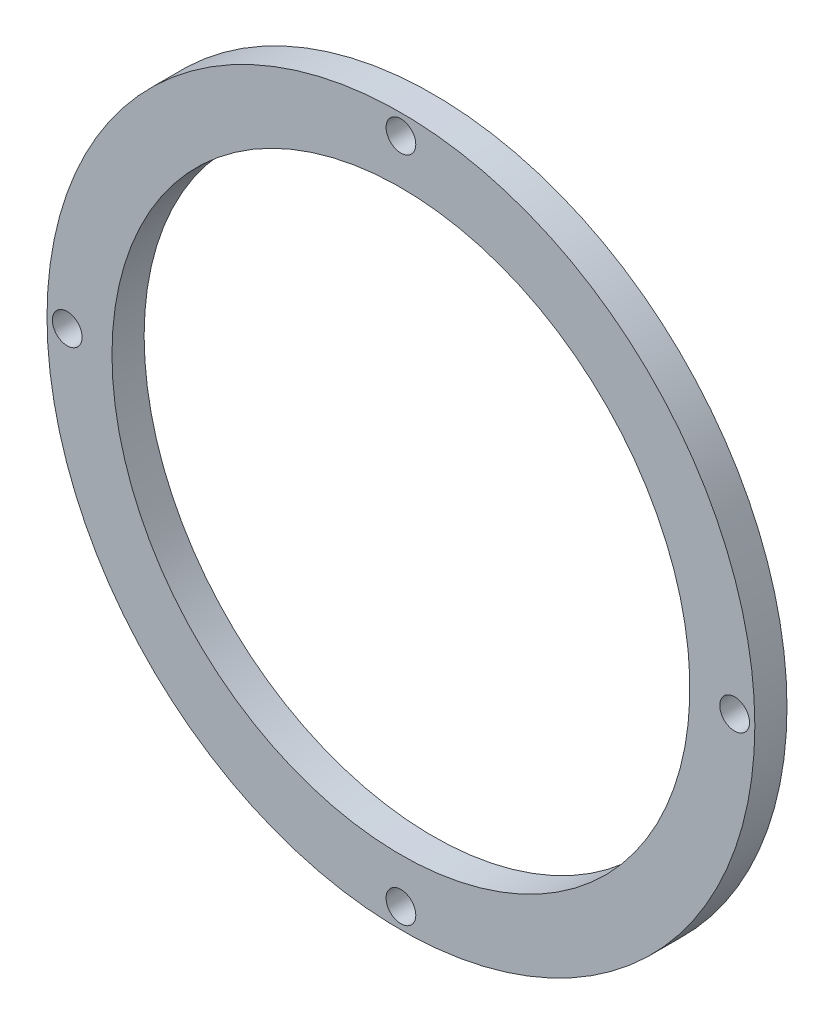
ISO-10303-21;
HEADER;
FILE_DESCRIPTION(('STEP AP214'),'2;1');
FILE_NAME('part.step','',(''),(''),'','','');
FILE_SCHEMA(('AUTOMOTIVE_DESIGN { 1 0 10303 214 1 1 1 1 }'));
ENDSEC;
DATA;
#1=APPLICATION_CONTEXT('core data for automotive mechanical design processes');
#2=APPLICATION_PROTOCOL_DEFINITION('international standard','automotive_design',2000,#1);
#3=PRODUCT_CONTEXT('',#1,'mechanical');
#4=PRODUCT('Part','Part','',(#3));
#5=PRODUCT_RELATED_PRODUCT_CATEGORY('part','',(#4));
#6=PRODUCT_DEFINITION_FORMATION('','',#4);
#7=PRODUCT_DEFINITION_CONTEXT('part definition',#1,'design');
#8=PRODUCT_DEFINITION('design','',#6,#7);
#9=PRODUCT_DEFINITION_SHAPE('','',#8);
#10=(LENGTH_UNIT() NAMED_UNIT(*) SI_UNIT(.MILLI.,.METRE.));
#11=(NAMED_UNIT(*) PLANE_ANGLE_UNIT() SI_UNIT($,.RADIAN.));
#12=(NAMED_UNIT(*) SI_UNIT($,.STERADIAN.) SOLID_ANGLE_UNIT());
#13=UNCERTAINTY_MEASURE_WITH_UNIT(LENGTH_MEASURE(1.E-05),#10,'distance_accuracy_value','');
#14=(GEOMETRIC_REPRESENTATION_CONTEXT(3) GLOBAL_UNCERTAINTY_ASSIGNED_CONTEXT((#13)) GLOBAL_UNIT_ASSIGNED_CONTEXT((#10,
#11,#12)) REPRESENTATION_CONTEXT('',''));
#15=CARTESIAN_POINT('',(0.,0.,0.));
#16=DIRECTION('',(0.,0.,1.));
#17=DIRECTION('',(1.,0.,0.));
#18=AXIS2_PLACEMENT_3D('',#15,#16,#17);
#19=CARTESIAN_POINT('',(0.,0.,3.18));
#20=DIRECTION('',(0.,0.,1.));
#21=DIRECTION('',(1.,0.,0.));
#22=AXIS2_PLACEMENT_3D('',#19,#20,#21);
#23=PLANE('',#22);
#24=CARTESIAN_POINT('',(-33.,-1.15218884181823E-13,3.18));
#25=DIRECTION('',(0.,0.,1.));
#26=DIRECTION('',(0.,1.,0.));
#27=AXIS2_PLACEMENT_3D('',#24,#25,#26);
#28=CIRCLE('',#27,1.47);
#29=CARTESIAN_POINT('',(-31.53,-1.15218884181823E-13,3.18));
#30=VERTEX_POINT('',#29);
#31=EDGE_CURVE('E84',#30,#30,#28,.T.);
#32=ORIENTED_EDGE('',*,*,#31,.F.);
#33=EDGE_LOOP('',(#32));
#34=FACE_BOUND('',#33,.T.);
#35=CARTESIAN_POINT('',(0.,-33.,3.18));
#36=DIRECTION('',(0.,0.,1.));
#37=DIRECTION('',(-1.,0.,0.));
#38=AXIS2_PLACEMENT_3D('',#35,#36,#37);
#39=CIRCLE('',#38,1.47);
#40=CARTESIAN_POINT('',(1.47,-33.,3.18));
#41=VERTEX_POINT('',#40);
#42=EDGE_CURVE('E76',#41,#41,#39,.T.);
#43=ORIENTED_EDGE('',*,*,#42,.F.);
#44=EDGE_LOOP('',(#43));
#45=FACE_BOUND('',#44,.T.);
#46=CARTESIAN_POINT('',(33.,3.4565665254547E-13,3.18));
#47=DIRECTION('',(0.,0.,1.));
#48=DIRECTION('',(0.,-1.,0.));
#49=AXIS2_PLACEMENT_3D('',#46,#47,#48);
#50=CIRCLE('',#49,1.47);
#51=CARTESIAN_POINT('',(34.47,3.4565665254547E-13,3.18));
#52=VERTEX_POINT('',#51);
#53=EDGE_CURVE('E68',#52,#52,#50,.T.);
#54=ORIENTED_EDGE('',*,*,#53,.F.);
#55=EDGE_LOOP('',(#54));
#56=FACE_BOUND('',#55,.T.);
#57=CARTESIAN_POINT('',(0.,33.,3.18));
#58=DIRECTION('',(0.,0.,1.));
#59=DIRECTION('',(1.,0.,0.));
#60=AXIS2_PLACEMENT_3D('',#57,#58,#59);
#61=CIRCLE('',#60,1.47);
#62=CARTESIAN_POINT('',(1.47,33.,3.18));
#63=VERTEX_POINT('',#62);
#64=EDGE_CURVE('E60',#63,#63,#61,.T.);
#65=ORIENTED_EDGE('',*,*,#64,.F.);
#66=EDGE_LOOP('',(#65));
#67=FACE_BOUND('',#66,.T.);
#68=CARTESIAN_POINT('',(0.,0.,3.18));
#69=DIRECTION('',(0.,0.,1.));
#70=DIRECTION('',(1.,0.,0.));
#71=AXIS2_PLACEMENT_3D('',#68,#69,#70);
#72=CIRCLE('',#71,35.);
#73=CARTESIAN_POINT('',(-35.,0.,3.18));
#74=VERTEX_POINT('',#73);
#75=EDGE_CURVE('E10',#74,#74,#72,.T.);
#76=ORIENTED_EDGE('',*,*,#75,.T.);
#77=EDGE_LOOP('',(#76));
#78=FACE_BOUND('',#77,.T.);
#79=CARTESIAN_POINT('',(0.,0.,3.18));
#80=DIRECTION('',(0.,0.,1.));
#81=DIRECTION('',(1.,0.,0.));
#82=AXIS2_PLACEMENT_3D('',#79,#80,#81);
#83=CIRCLE('',#82,28.575);
#84=CARTESIAN_POINT('',(-28.575,0.,3.18));
#85=VERTEX_POINT('',#84);
#86=EDGE_CURVE('E50',#85,#85,#83,.T.);
#87=ORIENTED_EDGE('',*,*,#86,.F.);
#88=EDGE_LOOP('',(#87));
#89=FACE_BOUND('',#88,.T.);
#90=ADVANCED_FACE('F37',(#34,#45,#56,#67,#78,#89),#23,.T.);
#91=CARTESIAN_POINT('',(0.,0.,0.));
#92=DIRECTION('',(0.,0.,1.));
#93=DIRECTION('',(1.,0.,0.));
#94=AXIS2_PLACEMENT_3D('',#91,#92,#93);
#95=PLANE('',#94);
#96=CARTESIAN_POINT('',(-33.,-1.15218884181823E-13,0.));
#97=DIRECTION('',(0.,0.,1.));
#98=DIRECTION('',(0.,1.,0.));
#99=AXIS2_PLACEMENT_3D('',#96,#97,#98);
#100=CIRCLE('',#99,1.47);
#101=CARTESIAN_POINT('',(-31.53,-1.15218884181823E-13,0.));
#102=VERTEX_POINT('',#101);
#103=EDGE_CURVE('E64',#102,#102,#100,.T.);
#104=ORIENTED_EDGE('',*,*,#103,.T.);
#105=EDGE_LOOP('',(#104));
#106=FACE_BOUND('',#105,.T.);
#107=CARTESIAN_POINT('',(0.,-33.,0.));
#108=DIRECTION('',(0.,0.,1.));
#109=DIRECTION('',(-1.,0.,0.));
#110=AXIS2_PLACEMENT_3D('',#107,#108,#109);
#111=CIRCLE('',#110,1.47);
#112=CARTESIAN_POINT('',(1.47,-33.,0.));
#113=VERTEX_POINT('',#112);
#114=EDGE_CURVE('E80',#113,#113,#111,.T.);
#115=ORIENTED_EDGE('',*,*,#114,.T.);
#116=EDGE_LOOP('',(#115));
#117=FACE_BOUND('',#116,.T.);
#118=CARTESIAN_POINT('',(33.,3.4565665254547E-13,0.));
#119=DIRECTION('',(0.,0.,1.));
#120=DIRECTION('',(0.,-1.,0.));
#121=AXIS2_PLACEMENT_3D('',#118,#119,#120);
#122=CIRCLE('',#121,1.47);
#123=CARTESIAN_POINT('',(34.47,3.4565665254547E-13,0.));
#124=VERTEX_POINT('',#123);
#125=EDGE_CURVE('E72',#124,#124,#122,.T.);
#126=ORIENTED_EDGE('',*,*,#125,.T.);
#127=EDGE_LOOP('',(#126));
#128=FACE_BOUND('',#127,.T.);
#129=CARTESIAN_POINT('',(0.,33.,0.));
#130=DIRECTION('',(0.,0.,1.));
#131=DIRECTION('',(1.,0.,0.));
#132=AXIS2_PLACEMENT_3D('',#129,#130,#131);
#133=CIRCLE('',#132,1.47);
#134=CARTESIAN_POINT('',(1.47,33.,0.));
#135=VERTEX_POINT('',#134);
#136=EDGE_CURVE('E56',#135,#135,#133,.T.);
#137=ORIENTED_EDGE('',*,*,#136,.T.);
#138=EDGE_LOOP('',(#137));
#139=FACE_BOUND('',#138,.T.);
#140=CARTESIAN_POINT('',(0.,0.,0.));
#141=DIRECTION('',(0.,0.,1.));
#142=DIRECTION('',(1.,0.,0.));
#143=AXIS2_PLACEMENT_3D('',#140,#141,#142);
#144=CIRCLE('',#143,35.);
#145=CARTESIAN_POINT('',(-35.,0.,0.));
#146=VERTEX_POINT('',#145);
#147=EDGE_CURVE('E41',#146,#146,#144,.T.);
#148=ORIENTED_EDGE('',*,*,#147,.F.);
#149=EDGE_LOOP('',(#148));
#150=FACE_BOUND('',#149,.T.);
#151=CARTESIAN_POINT('',(0.,0.,0.));
#152=DIRECTION('',(0.,0.,1.));
#153=DIRECTION('',(1.,0.,0.));
#154=AXIS2_PLACEMENT_3D('',#151,#152,#153);
#155=CIRCLE('',#154,28.575);
#156=CARTESIAN_POINT('',(-28.575,0.,0.));
#157=VERTEX_POINT('',#156);
#158=EDGE_CURVE('E52',#157,#157,#155,.T.);
#159=ORIENTED_EDGE('',*,*,#158,.T.);
#160=EDGE_LOOP('',(#159));
#161=FACE_BOUND('',#160,.T.);
#162=ADVANCED_FACE('F92',(#106,#117,#128,#139,#150,#161),#95,.F.);
#163=CARTESIAN_POINT('',(0.,0.,3.18));
#164=DIRECTION('',(0.,0.,-1.));
#165=DIRECTION('',(-1.,0.,0.));
#166=AXIS2_PLACEMENT_3D('',#163,#164,#165);
#167=CYLINDRICAL_SURFACE('',#166,35.);
#168=CARTESIAN_POINT('',(-35.,0.,3.18));
#169=CARTESIAN_POINT('',(-35.,0.,3.146875));
#170=CARTESIAN_POINT('',(-35.,0.,3.11375));
#171=CARTESIAN_POINT('',(-35.,0.,3.0475));
#172=CARTESIAN_POINT('',(-35.,0.,3.014375));
#173=CARTESIAN_POINT('',(-35.,0.,2.948125));
#174=CARTESIAN_POINT('',(-35.,0.,2.915));
#175=CARTESIAN_POINT('',(-35.,0.,2.84875));
#176=CARTESIAN_POINT('',(-35.,0.,2.815625));
#177=CARTESIAN_POINT('',(-35.,0.,2.749375));
#178=CARTESIAN_POINT('',(-35.,0.,2.71625));
#179=CARTESIAN_POINT('',(-35.,0.,2.65));
#180=CARTESIAN_POINT('',(-35.,0.,2.616875));
#181=CARTESIAN_POINT('',(-35.,0.,2.550625));
#182=CARTESIAN_POINT('',(-35.,0.,2.5175));
#183=CARTESIAN_POINT('',(-35.,0.,2.45125));
#184=CARTESIAN_POINT('',(-35.,0.,2.418125));
#185=CARTESIAN_POINT('',(-35.,0.,2.351875));
#186=CARTESIAN_POINT('',(-35.,0.,2.31875));
#187=CARTESIAN_POINT('',(-35.,0.,2.2525));
#188=CARTESIAN_POINT('',(-35.,0.,2.219375));
#189=CARTESIAN_POINT('',(-35.,0.,2.153125));
#190=CARTESIAN_POINT('',(-35.,0.,2.12));
#191=CARTESIAN_POINT('',(-35.,0.,2.05375));
#192=CARTESIAN_POINT('',(-35.,0.,2.020625));
#193=CARTESIAN_POINT('',(-35.,0.,1.954375));
#194=CARTESIAN_POINT('',(-35.,0.,1.92125));
#195=CARTESIAN_POINT('',(-35.,0.,1.855));
#196=CARTESIAN_POINT('',(-35.,0.,1.821875));
#197=CARTESIAN_POINT('',(-35.,0.,1.755625));
#198=CARTESIAN_POINT('',(-35.,0.,1.7225));
#199=CARTESIAN_POINT('',(-35.,0.,1.65625));
#200=CARTESIAN_POINT('',(-35.,0.,1.623125));
#201=CARTESIAN_POINT('',(-35.,0.,1.556875));
#202=CARTESIAN_POINT('',(-35.,0.,1.52375));
#203=CARTESIAN_POINT('',(-35.,0.,1.4575));
#204=CARTESIAN_POINT('',(-35.,0.,1.424375));
#205=CARTESIAN_POINT('',(-35.,0.,1.358125));
#206=CARTESIAN_POINT('',(-35.,0.,1.325));
#207=CARTESIAN_POINT('',(-35.,0.,1.25875));
#208=CARTESIAN_POINT('',(-35.,0.,1.225625));
#209=CARTESIAN_POINT('',(-35.,0.,1.159375));
#210=CARTESIAN_POINT('',(-35.,0.,1.12625));
#211=CARTESIAN_POINT('',(-35.,0.,1.06));
#212=CARTESIAN_POINT('',(-35.,0.,1.026875));
#213=CARTESIAN_POINT('',(-35.,0.,0.960625));
#214=CARTESIAN_POINT('',(-35.,0.,0.9275));
#215=CARTESIAN_POINT('',(-35.,0.,0.86125));
#216=CARTESIAN_POINT('',(-35.,0.,0.828125));
#217=CARTESIAN_POINT('',(-35.,0.,0.761875));
#218=CARTESIAN_POINT('',(-35.,0.,0.72875));
#219=CARTESIAN_POINT('',(-35.,0.,0.6625));
#220=CARTESIAN_POINT('',(-35.,0.,0.629375));
#221=CARTESIAN_POINT('',(-35.,0.,0.563125));
#222=CARTESIAN_POINT('',(-35.,0.,0.53));
#223=CARTESIAN_POINT('',(-35.,0.,0.46375));
#224=CARTESIAN_POINT('',(-35.,0.,0.430625));
#225=CARTESIAN_POINT('',(-35.,0.,0.364375));
#226=CARTESIAN_POINT('',(-35.,0.,0.33125));
#227=CARTESIAN_POINT('',(-35.,0.,0.265));
#228=CARTESIAN_POINT('',(-35.,0.,0.231875));
#229=CARTESIAN_POINT('',(-35.,0.,0.165625));
#230=CARTESIAN_POINT('',(-35.,0.,0.1325));
#231=CARTESIAN_POINT('',(-35.,0.,0.06625));
#232=CARTESIAN_POINT('',(-35.,0.,0.033125));
#233=CARTESIAN_POINT('',(-35.,0.,0.));
#234=B_SPLINE_CURVE_WITH_KNOTS('',3,(#168,#169,#170,#171,#172,#173,#174,#175,#176,#177,#178,
#179,#180,#181,#182,#183,#184,#185,#186,#187,#188,#189,#190,#191,#192,#193,#194,#195,#196,#197,
#198,#199,#200,#201,#202,#203,#204,#205,#206,#207,#208,#209,#210,#211,#212,#213,#214,#215,#216,
#217,#218,#219,#220,#221,#222,#223,#224,#225,#226,#227,#228,#229,#230,#231,#232,#233),
.UNSPECIFIED.,.F.,.F.,(4,2,2,2,2,2,2,2,2,2,2,2,2,2,2,2,2,2,2,2,2,2,2,2,2,2,2,2,2,2,2,2,4),(0.,
0.0993749999999996,0.19875,0.298125,0.3975,0.496875,0.59625,0.695625,0.795,0.894375,0.99375,
1.093125,1.1925,1.291875,1.39125,1.490625,1.59,1.689375,1.78875,1.888125,1.9875,2.086875,
2.18625,2.285625,2.385,2.484375,2.58375,2.683125,2.7825,2.881875,2.98125,3.080625,3.18),.UNSPECIFIED.);
#235=EDGE_CURVE('BSEAM39',#74,#146,#234,.T.);
#236=ORIENTED_EDGE('',*,*,#75,.F.);
#237=ORIENTED_EDGE('',*,*,#147,.T.);
#238=ORIENTED_EDGE('',*,*,#235,.T.);
#239=ORIENTED_EDGE('',*,*,#235,.F.);
#240=EDGE_LOOP('',(#236,#238,#237,#239));
#241=FACE_BOUND('',#240,.T.);
#242=ADVANCED_FACE('F39',(#241),#167,.T.);
#243=CARTESIAN_POINT('',(0.,0.,3.18));
#244=DIRECTION('',(0.,0.,-1.));
#245=DIRECTION('',(-1.,0.,0.));
#246=AXIS2_PLACEMENT_3D('',#243,#244,#245);
#247=CYLINDRICAL_SURFACE('',#246,28.575);
#248=CARTESIAN_POINT('',(-28.575,0.,3.18));
#249=CARTESIAN_POINT('',(-28.575,0.,3.146875));
#250=CARTESIAN_POINT('',(-28.575,0.,3.11375));
#251=CARTESIAN_POINT('',(-28.575,0.,3.0475));
#252=CARTESIAN_POINT('',(-28.575,0.,3.014375));
#253=CARTESIAN_POINT('',(-28.575,0.,2.948125));
#254=CARTESIAN_POINT('',(-28.575,0.,2.915));
#255=CARTESIAN_POINT('',(-28.575,0.,2.84875));
#256=CARTESIAN_POINT('',(-28.575,0.,2.815625));
#257=CARTESIAN_POINT('',(-28.575,0.,2.749375));
#258=CARTESIAN_POINT('',(-28.575,0.,2.71625));
#259=CARTESIAN_POINT('',(-28.575,0.,2.65));
#260=CARTESIAN_POINT('',(-28.575,0.,2.616875));
#261=CARTESIAN_POINT('',(-28.575,0.,2.550625));
#262=CARTESIAN_POINT('',(-28.575,0.,2.5175));
#263=CARTESIAN_POINT('',(-28.575,0.,2.45125));
#264=CARTESIAN_POINT('',(-28.575,0.,2.418125));
#265=CARTESIAN_POINT('',(-28.575,0.,2.351875));
#266=CARTESIAN_POINT('',(-28.575,0.,2.31875));
#267=CARTESIAN_POINT('',(-28.575,0.,2.2525));
#268=CARTESIAN_POINT('',(-28.575,0.,2.219375));
#269=CARTESIAN_POINT('',(-28.575,0.,2.153125));
#270=CARTESIAN_POINT('',(-28.575,0.,2.12));
#271=CARTESIAN_POINT('',(-28.575,0.,2.05375));
#272=CARTESIAN_POINT('',(-28.575,0.,2.020625));
#273=CARTESIAN_POINT('',(-28.575,0.,1.954375));
#274=CARTESIAN_POINT('',(-28.575,0.,1.92125));
#275=CARTESIAN_POINT('',(-28.575,0.,1.855));
#276=CARTESIAN_POINT('',(-28.575,0.,1.821875));
#277=CARTESIAN_POINT('',(-28.575,0.,1.755625));
#278=CARTESIAN_POINT('',(-28.575,0.,1.7225));
#279=CARTESIAN_POINT('',(-28.575,0.,1.65625));
#280=CARTESIAN_POINT('',(-28.575,0.,1.623125));
#281=CARTESIAN_POINT('',(-28.575,0.,1.556875));
#282=CARTESIAN_POINT('',(-28.575,0.,1.52375));
#283=CARTESIAN_POINT('',(-28.575,0.,1.4575));
#284=CARTESIAN_POINT('',(-28.575,0.,1.424375));
#285=CARTESIAN_POINT('',(-28.575,0.,1.358125));
#286=CARTESIAN_POINT('',(-28.575,0.,1.325));
#287=CARTESIAN_POINT('',(-28.575,0.,1.25875));
#288=CARTESIAN_POINT('',(-28.575,0.,1.225625));
#289=CARTESIAN_POINT('',(-28.575,0.,1.159375));
#290=CARTESIAN_POINT('',(-28.575,0.,1.12625));
#291=CARTESIAN_POINT('',(-28.575,0.,1.06));
#292=CARTESIAN_POINT('',(-28.575,0.,1.026875));
#293=CARTESIAN_POINT('',(-28.575,0.,0.960625));
#294=CARTESIAN_POINT('',(-28.575,0.,0.9275));
#295=CARTESIAN_POINT('',(-28.575,0.,0.86125));
#296=CARTESIAN_POINT('',(-28.575,0.,0.828125));
#297=CARTESIAN_POINT('',(-28.575,0.,0.761875));
#298=CARTESIAN_POINT('',(-28.575,0.,0.72875));
#299=CARTESIAN_POINT('',(-28.575,0.,0.6625));
#300=CARTESIAN_POINT('',(-28.575,0.,0.629375));
#301=CARTESIAN_POINT('',(-28.575,0.,0.563125));
#302=CARTESIAN_POINT('',(-28.575,0.,0.53));
#303=CARTESIAN_POINT('',(-28.575,0.,0.46375));
#304=CARTESIAN_POINT('',(-28.575,0.,0.430625));
#305=CARTESIAN_POINT('',(-28.575,0.,0.364375));
#306=CARTESIAN_POINT('',(-28.575,0.,0.33125));
#307=CARTESIAN_POINT('',(-28.575,0.,0.265));
#308=CARTESIAN_POINT('',(-28.575,0.,0.231875));
#309=CARTESIAN_POINT('',(-28.575,0.,0.165625));
#310=CARTESIAN_POINT('',(-28.575,0.,0.1325));
#311=CARTESIAN_POINT('',(-28.575,0.,0.06625));
#312=CARTESIAN_POINT('',(-28.575,0.,0.033125));
#313=CARTESIAN_POINT('',(-28.575,0.,0.));
#314=B_SPLINE_CURVE_WITH_KNOTS('',3,(#248,#249,#250,#251,#252,#253,#254,#255,#256,#257,#258,
#259,#260,#261,#262,#263,#264,#265,#266,#267,#268,#269,#270,#271,#272,#273,#274,#275,#276,#277,
#278,#279,#280,#281,#282,#283,#284,#285,#286,#287,#288,#289,#290,#291,#292,#293,#294,#295,#296,
#297,#298,#299,#300,#301,#302,#303,#304,#305,#306,#307,#308,#309,#310,#311,#312,#313),
.UNSPECIFIED.,.F.,.F.,(4,2,2,2,2,2,2,2,2,2,2,2,2,2,2,2,2,2,2,2,2,2,2,2,2,2,2,2,2,2,2,2,4),(0.,
0.0993749999999996,0.19875,0.298125,0.3975,0.496875,0.59625,0.695625,0.795,0.894375,0.99375,
1.093125,1.1925,1.291875,1.39125,1.490625,1.59,1.689375,1.78875,1.888125,1.9875,2.086875,
2.18625,2.285625,2.385,2.484375,2.58375,2.683125,2.7825,2.881875,2.98125,3.080625,3.18),.UNSPECIFIED.);
#315=EDGE_CURVE('BSEAM113',#85,#157,#314,.T.);
#316=ORIENTED_EDGE('',*,*,#86,.T.);
#317=ORIENTED_EDGE('',*,*,#158,.F.);
#318=ORIENTED_EDGE('',*,*,#315,.T.);
#319=ORIENTED_EDGE('',*,*,#315,.F.);
#320=EDGE_LOOP('',(#316,#318,#317,#319));
#321=FACE_BOUND('',#320,.T.);
#322=ADVANCED_FACE('F113',(#321),#247,.F.);
#323=CARTESIAN_POINT('',(0.,33.,0.));
#324=DIRECTION('',(0.,0.,1.));
#325=DIRECTION('',(1.,0.,0.));
#326=AXIS2_PLACEMENT_3D('',#323,#324,#325);
#327=CYLINDRICAL_SURFACE('',#326,1.47);
#328=CARTESIAN_POINT('',(1.47,33.,0.));
#329=CARTESIAN_POINT('',(1.47,33.,0.033125));
#330=CARTESIAN_POINT('',(1.47,33.,0.06625));
#331=CARTESIAN_POINT('',(1.47,33.,0.1325));
#332=CARTESIAN_POINT('',(1.47,33.,0.165625));
#333=CARTESIAN_POINT('',(1.47,33.,0.231875));
#334=CARTESIAN_POINT('',(1.47,33.,0.265));
#335=CARTESIAN_POINT('',(1.47,33.,0.33125));
#336=CARTESIAN_POINT('',(1.47,33.,0.364375));
#337=CARTESIAN_POINT('',(1.47,33.,0.430625));
#338=CARTESIAN_POINT('',(1.47,33.,0.46375));
#339=CARTESIAN_POINT('',(1.47,33.,0.53));
#340=CARTESIAN_POINT('',(1.47,33.,0.563125));
#341=CARTESIAN_POINT('',(1.47,33.,0.629375));
#342=CARTESIAN_POINT('',(1.47,33.,0.6625));
#343=CARTESIAN_POINT('',(1.47,33.,0.72875));
#344=CARTESIAN_POINT('',(1.47,33.,0.761875));
#345=CARTESIAN_POINT('',(1.47,33.,0.828125));
#346=CARTESIAN_POINT('',(1.47,33.,0.86125));
#347=CARTESIAN_POINT('',(1.47,33.,0.9275));
#348=CARTESIAN_POINT('',(1.47,33.,0.960625));
#349=CARTESIAN_POINT('',(1.47,33.,1.026875));
#350=CARTESIAN_POINT('',(1.47,33.,1.06));
#351=CARTESIAN_POINT('',(1.47,33.,1.12625));
#352=CARTESIAN_POINT('',(1.47,33.,1.159375));
#353=CARTESIAN_POINT('',(1.47,33.,1.225625));
#354=CARTESIAN_POINT('',(1.47,33.,1.25875));
#355=CARTESIAN_POINT('',(1.47,33.,1.325));
#356=CARTESIAN_POINT('',(1.47,33.,1.358125));
#357=CARTESIAN_POINT('',(1.47,33.,1.424375));
#358=CARTESIAN_POINT('',(1.47,33.,1.4575));
#359=CARTESIAN_POINT('',(1.47,33.,1.52375));
#360=CARTESIAN_POINT('',(1.47,33.,1.556875));
#361=CARTESIAN_POINT('',(1.47,33.,1.623125));
#362=CARTESIAN_POINT('',(1.47,33.,1.65625));
#363=CARTESIAN_POINT('',(1.47,33.,1.7225));
#364=CARTESIAN_POINT('',(1.47,33.,1.755625));
#365=CARTESIAN_POINT('',(1.47,33.,1.821875));
#366=CARTESIAN_POINT('',(1.47,33.,1.855));
#367=CARTESIAN_POINT('',(1.47,33.,1.92125));
#368=CARTESIAN_POINT('',(1.47,33.,1.954375));
#369=CARTESIAN_POINT('',(1.47,33.,2.020625));
#370=CARTESIAN_POINT('',(1.47,33.,2.05375));
#371=CARTESIAN_POINT('',(1.47,33.,2.12));
#372=CARTESIAN_POINT('',(1.47,33.,2.153125));
#373=CARTESIAN_POINT('',(1.47,33.,2.219375));
#374=CARTESIAN_POINT('',(1.47,33.,2.2525));
#375=CARTESIAN_POINT('',(1.47,33.,2.31875));
#376=CARTESIAN_POINT('',(1.47,33.,2.351875));
#377=CARTESIAN_POINT('',(1.47,33.,2.418125));
#378=CARTESIAN_POINT('',(1.47,33.,2.45125));
#379=CARTESIAN_POINT('',(1.47,33.,2.5175));
#380=CARTESIAN_POINT('',(1.47,33.,2.550625));
#381=CARTESIAN_POINT('',(1.47,33.,2.616875));
#382=CARTESIAN_POINT('',(1.47,33.,2.65));
#383=CARTESIAN_POINT('',(1.47,33.,2.71625));
#384=CARTESIAN_POINT('',(1.47,33.,2.749375));
#385=CARTESIAN_POINT('',(1.47,33.,2.815625));
#386=CARTESIAN_POINT('',(1.47,33.,2.84875));
#387=CARTESIAN_POINT('',(1.47,33.,2.915));
#388=CARTESIAN_POINT('',(1.47,33.,2.948125));
#389=CARTESIAN_POINT('',(1.47,33.,3.014375));
#390=CARTESIAN_POINT('',(1.47,33.,3.0475));
#391=CARTESIAN_POINT('',(1.47,33.,3.11375));
#392=CARTESIAN_POINT('',(1.47,33.,3.146875));
#393=CARTESIAN_POINT('',(1.47,33.,3.18));
#394=B_SPLINE_CURVE_WITH_KNOTS('',3,(#328,#329,#330,#331,#332,#333,#334,#335,#336,#337,#338,
#339,#340,#341,#342,#343,#344,#345,#346,#347,#348,#349,#350,#351,#352,#353,#354,#355,#356,#357,
#358,#359,#360,#361,#362,#363,#364,#365,#366,#367,#368,#369,#370,#371,#372,#373,#374,#375,#376,
#377,#378,#379,#380,#381,#382,#383,#384,#385,#386,#387,#388,#389,#390,#391,#392,#393),
.UNSPECIFIED.,.F.,.F.,(4,2,2,2,2,2,2,2,2,2,2,2,2,2,2,2,2,2,2,2,2,2,2,2,2,2,2,2,2,2,2,2,4),(0.,
0.099375,0.19875,0.298125,0.3975,0.496875,0.59625,0.695625,0.795,0.894375,0.99375,1.093125,
1.1925,1.291875,1.39125,1.490625,1.59,1.689375,1.78875,1.888125,1.9875,2.086875,2.18625,
2.285625,2.385,2.484375,2.58375,2.683125,2.7825,2.881875,2.98125,3.080625,3.18),.UNSPECIFIED.);
#395=EDGE_CURVE('BSEAM116',#135,#63,#394,.T.);
#396=ORIENTED_EDGE('',*,*,#136,.F.);
#397=ORIENTED_EDGE('',*,*,#64,.T.);
#398=ORIENTED_EDGE('',*,*,#395,.T.);
#399=ORIENTED_EDGE('',*,*,#395,.F.);
#400=EDGE_LOOP('',(#396,#398,#397,#399));
#401=FACE_BOUND('',#400,.T.);
#402=ADVANCED_FACE('F116',(#401),#327,.F.);
#403=CARTESIAN_POINT('',(33.,3.4565665254547E-13,0.));
#404=DIRECTION('',(0.,0.,1.));
#405=DIRECTION('',(1.,0.,0.));
#406=AXIS2_PLACEMENT_3D('',#403,#404,#405);
#407=CYLINDRICAL_SURFACE('',#406,1.47);
#408=CARTESIAN_POINT('',(34.47,3.4565665254547E-13,0.));
#409=CARTESIAN_POINT('',(34.47,3.4565665254547E-13,0.033125));
#410=CARTESIAN_POINT('',(34.47,3.4565665254547E-13,0.06625));
#411=CARTESIAN_POINT('',(34.47,3.4565665254547E-13,0.1325));
#412=CARTESIAN_POINT('',(34.47,3.4565665254547E-13,0.165625));
#413=CARTESIAN_POINT('',(34.47,3.4565665254547E-13,0.231875));
#414=CARTESIAN_POINT('',(34.47,3.4565665254547E-13,0.265));
#415=CARTESIAN_POINT('',(34.47,3.4565665254547E-13,0.33125));
#416=CARTESIAN_POINT('',(34.47,3.4565665254547E-13,0.364375));
#417=CARTESIAN_POINT('',(34.47,3.4565665254547E-13,0.430625));
#418=CARTESIAN_POINT('',(34.47,3.4565665254547E-13,0.46375));
#419=CARTESIAN_POINT('',(34.47,3.4565665254547E-13,0.53));
#420=CARTESIAN_POINT('',(34.47,3.4565665254547E-13,0.563125));
#421=CARTESIAN_POINT('',(34.47,3.4565665254547E-13,0.629375));
#422=CARTESIAN_POINT('',(34.47,3.4565665254547E-13,0.6625));
#423=CARTESIAN_POINT('',(34.47,3.4565665254547E-13,0.72875));
#424=CARTESIAN_POINT('',(34.47,3.4565665254547E-13,0.761875));
#425=CARTESIAN_POINT('',(34.47,3.4565665254547E-13,0.828125));
#426=CARTESIAN_POINT('',(34.47,3.4565665254547E-13,0.86125));
#427=CARTESIAN_POINT('',(34.47,3.4565665254547E-13,0.9275));
#428=CARTESIAN_POINT('',(34.47,3.4565665254547E-13,0.960625));
#429=CARTESIAN_POINT('',(34.47,3.4565665254547E-13,1.026875));
#430=CARTESIAN_POINT('',(34.47,3.4565665254547E-13,1.06));
#431=CARTESIAN_POINT('',(34.47,3.4565665254547E-13,1.12625));
#432=CARTESIAN_POINT('',(34.47,3.4565665254547E-13,1.159375));
#433=CARTESIAN_POINT('',(34.47,3.4565665254547E-13,1.225625));
#434=CARTESIAN_POINT('',(34.47,3.4565665254547E-13,1.25875));
#435=CARTESIAN_POINT('',(34.47,3.4565665254547E-13,1.325));
#436=CARTESIAN_POINT('',(34.47,3.4565665254547E-13,1.358125));
#437=CARTESIAN_POINT('',(34.47,3.4565665254547E-13,1.424375));
#438=CARTESIAN_POINT('',(34.47,3.4565665254547E-13,1.4575));
#439=CARTESIAN_POINT('',(34.47,3.4565665254547E-13,1.52375));
#440=CARTESIAN_POINT('',(34.47,3.4565665254547E-13,1.556875));
#441=CARTESIAN_POINT('',(34.47,3.4565665254547E-13,1.623125));
#442=CARTESIAN_POINT('',(34.47,3.4565665254547E-13,1.65625));
#443=CARTESIAN_POINT('',(34.47,3.4565665254547E-13,1.7225));
#444=CARTESIAN_POINT('',(34.47,3.4565665254547E-13,1.755625));
#445=CARTESIAN_POINT('',(34.47,3.4565665254547E-13,1.821875));
#446=CARTESIAN_POINT('',(34.47,3.4565665254547E-13,1.855));
#447=CARTESIAN_POINT('',(34.47,3.4565665254547E-13,1.92125));
#448=CARTESIAN_POINT('',(34.47,3.4565665254547E-13,1.954375));
#449=CARTESIAN_POINT('',(34.47,3.4565665254547E-13,2.020625));
#450=CARTESIAN_POINT('',(34.47,3.4565665254547E-13,2.05375));
#451=CARTESIAN_POINT('',(34.47,3.4565665254547E-13,2.12));
#452=CARTESIAN_POINT('',(34.47,3.4565665254547E-13,2.153125));
#453=CARTESIAN_POINT('',(34.47,3.4565665254547E-13,2.219375));
#454=CARTESIAN_POINT('',(34.47,3.4565665254547E-13,2.2525));
#455=CARTESIAN_POINT('',(34.47,3.4565665254547E-13,2.31875));
#456=CARTESIAN_POINT('',(34.47,3.4565665254547E-13,2.351875));
#457=CARTESIAN_POINT('',(34.47,3.4565665254547E-13,2.418125));
#458=CARTESIAN_POINT('',(34.47,3.4565665254547E-13,2.45125));
#459=CARTESIAN_POINT('',(34.47,3.4565665254547E-13,2.5175));
#460=CARTESIAN_POINT('',(34.47,3.4565665254547E-13,2.550625));
#461=CARTESIAN_POINT('',(34.47,3.4565665254547E-13,2.616875));
#462=CARTESIAN_POINT('',(34.47,3.4565665254547E-13,2.65));
#463=CARTESIAN_POINT('',(34.47,3.4565665254547E-13,2.71625));
#464=CARTESIAN_POINT('',(34.47,3.4565665254547E-13,2.749375));
#465=CARTESIAN_POINT('',(34.47,3.4565665254547E-13,2.815625));
#466=CARTESIAN_POINT('',(34.47,3.4565665254547E-13,2.84875));
#467=CARTESIAN_POINT('',(34.47,3.4565665254547E-13,2.915));
#468=CARTESIAN_POINT('',(34.47,3.4565665254547E-13,2.948125));
#469=CARTESIAN_POINT('',(34.47,3.4565665254547E-13,3.014375));
#470=CARTESIAN_POINT('',(34.47,3.4565665254547E-13,3.0475));
#471=CARTESIAN_POINT('',(34.47,3.4565665254547E-13,3.11375));
#472=CARTESIAN_POINT('',(34.47,3.4565665254547E-13,3.146875));
#473=CARTESIAN_POINT('',(34.47,3.4565665254547E-13,3.18));
#474=B_SPLINE_CURVE_WITH_KNOTS('',3,(#408,#409,#410,#411,#412,#413,#414,#415,#416,#417,#418,
#419,#420,#421,#422,#423,#424,#425,#426,#427,#428,#429,#430,#431,#432,#433,#434,#435,#436,#437,
#438,#439,#440,#441,#442,#443,#444,#445,#446,#447,#448,#449,#450,#451,#452,#453,#454,#455,#456,
#457,#458,#459,#460,#461,#462,#463,#464,#465,#466,#467,#468,#469,#470,#471,#472,#473),
.UNSPECIFIED.,.F.,.F.,(4,2,2,2,2,2,2,2,2,2,2,2,2,2,2,2,2,2,2,2,2,2,2,2,2,2,2,2,2,2,2,2,4),(0.,
0.099375,0.19875,0.298125,0.3975,0.496875,0.59625,0.695625,0.795,0.894375,0.99375,1.093125,
1.1925,1.291875,1.39125,1.490625,1.59,1.689375,1.78875,1.888125,1.9875,2.086875,2.18625,
2.285625,2.385,2.484375,2.58375,2.683125,2.7825,2.881875,2.98125,3.080625,3.18),.UNSPECIFIED.);
#475=EDGE_CURVE('BSEAM128',#124,#52,#474,.T.);
#476=ORIENTED_EDGE('',*,*,#125,.F.);
#477=ORIENTED_EDGE('',*,*,#53,.T.);
#478=ORIENTED_EDGE('',*,*,#475,.T.);
#479=ORIENTED_EDGE('',*,*,#475,.F.);
#480=EDGE_LOOP('',(#476,#478,#477,#479));
#481=FACE_BOUND('',#480,.T.);
#482=ADVANCED_FACE('F128',(#481),#407,.F.);
#483=CARTESIAN_POINT('',(0.,-33.,0.));
#484=DIRECTION('',(0.,0.,1.));
#485=DIRECTION('',(1.,0.,0.));
#486=AXIS2_PLACEMENT_3D('',#483,#484,#485);
#487=CYLINDRICAL_SURFACE('',#486,1.47);
#488=CARTESIAN_POINT('',(1.47,-33.,0.));
#489=CARTESIAN_POINT('',(1.47,-33.,0.033125));
#490=CARTESIAN_POINT('',(1.47,-33.,0.06625));
#491=CARTESIAN_POINT('',(1.47,-33.,0.1325));
#492=CARTESIAN_POINT('',(1.47,-33.,0.165625));
#493=CARTESIAN_POINT('',(1.47,-33.,0.231875));
#494=CARTESIAN_POINT('',(1.47,-33.,0.265));
#495=CARTESIAN_POINT('',(1.47,-33.,0.33125));
#496=CARTESIAN_POINT('',(1.47,-33.,0.364375));
#497=CARTESIAN_POINT('',(1.47,-33.,0.430625));
#498=CARTESIAN_POINT('',(1.47,-33.,0.46375));
#499=CARTESIAN_POINT('',(1.47,-33.,0.53));
#500=CARTESIAN_POINT('',(1.47,-33.,0.563125));
#501=CARTESIAN_POINT('',(1.47,-33.,0.629375));
#502=CARTESIAN_POINT('',(1.47,-33.,0.6625));
#503=CARTESIAN_POINT('',(1.47,-33.,0.72875));
#504=CARTESIAN_POINT('',(1.47,-33.,0.761875));
#505=CARTESIAN_POINT('',(1.47,-33.,0.828125));
#506=CARTESIAN_POINT('',(1.47,-33.,0.86125));
#507=CARTESIAN_POINT('',(1.47,-33.,0.9275));
#508=CARTESIAN_POINT('',(1.47,-33.,0.960625));
#509=CARTESIAN_POINT('',(1.47,-33.,1.026875));
#510=CARTESIAN_POINT('',(1.47,-33.,1.06));
#511=CARTESIAN_POINT('',(1.47,-33.,1.12625));
#512=CARTESIAN_POINT('',(1.47,-33.,1.159375));
#513=CARTESIAN_POINT('',(1.47,-33.,1.225625));
#514=CARTESIAN_POINT('',(1.47,-33.,1.25875));
#515=CARTESIAN_POINT('',(1.47,-33.,1.325));
#516=CARTESIAN_POINT('',(1.47,-33.,1.358125));
#517=CARTESIAN_POINT('',(1.47,-33.,1.424375));
#518=CARTESIAN_POINT('',(1.47,-33.,1.4575));
#519=CARTESIAN_POINT('',(1.47,-33.,1.52375));
#520=CARTESIAN_POINT('',(1.47,-33.,1.556875));
#521=CARTESIAN_POINT('',(1.47,-33.,1.623125));
#522=CARTESIAN_POINT('',(1.47,-33.,1.65625));
#523=CARTESIAN_POINT('',(1.47,-33.,1.7225));
#524=CARTESIAN_POINT('',(1.47,-33.,1.755625));
#525=CARTESIAN_POINT('',(1.47,-33.,1.821875));
#526=CARTESIAN_POINT('',(1.47,-33.,1.855));
#527=CARTESIAN_POINT('',(1.47,-33.,1.92125));
#528=CARTESIAN_POINT('',(1.47,-33.,1.954375));
#529=CARTESIAN_POINT('',(1.47,-33.,2.020625));
#530=CARTESIAN_POINT('',(1.47,-33.,2.05375));
#531=CARTESIAN_POINT('',(1.47,-33.,2.12));
#532=CARTESIAN_POINT('',(1.47,-33.,2.153125));
#533=CARTESIAN_POINT('',(1.47,-33.,2.219375));
#534=CARTESIAN_POINT('',(1.47,-33.,2.2525));
#535=CARTESIAN_POINT('',(1.47,-33.,2.31875));
#536=CARTESIAN_POINT('',(1.47,-33.,2.351875));
#537=CARTESIAN_POINT('',(1.47,-33.,2.418125));
#538=CARTESIAN_POINT('',(1.47,-33.,2.45125));
#539=CARTESIAN_POINT('',(1.47,-33.,2.5175));
#540=CARTESIAN_POINT('',(1.47,-33.,2.550625));
#541=CARTESIAN_POINT('',(1.47,-33.,2.616875));
#542=CARTESIAN_POINT('',(1.47,-33.,2.65));
#543=CARTESIAN_POINT('',(1.47,-33.,2.71625));
#544=CARTESIAN_POINT('',(1.47,-33.,2.749375));
#545=CARTESIAN_POINT('',(1.47,-33.,2.815625));
#546=CARTESIAN_POINT('',(1.47,-33.,2.84875));
#547=CARTESIAN_POINT('',(1.47,-33.,2.915));
#548=CARTESIAN_POINT('',(1.47,-33.,2.948125));
#549=CARTESIAN_POINT('',(1.47,-33.,3.014375));
#550=CARTESIAN_POINT('',(1.47,-33.,3.0475));
#551=CARTESIAN_POINT('',(1.47,-33.,3.11375));
#552=CARTESIAN_POINT('',(1.47,-33.,3.146875));
#553=CARTESIAN_POINT('',(1.47,-33.,3.18));
#554=B_SPLINE_CURVE_WITH_KNOTS('',3,(#488,#489,#490,#491,#492,#493,#494,#495,#496,#497,#498,
#499,#500,#501,#502,#503,#504,#505,#506,#507,#508,#509,#510,#511,#512,#513,#514,#515,#516,#517,
#518,#519,#520,#521,#522,#523,#524,#525,#526,#527,#528,#529,#530,#531,#532,#533,#534,#535,#536,
#537,#538,#539,#540,#541,#542,#543,#544,#545,#546,#547,#548,#549,#550,#551,#552,#553),
.UNSPECIFIED.,.F.,.F.,(4,2,2,2,2,2,2,2,2,2,2,2,2,2,2,2,2,2,2,2,2,2,2,2,2,2,2,2,2,2,2,2,4),(0.,
0.099375,0.19875,0.298125,0.3975,0.496875,0.59625,0.695625,0.795,0.894375,0.99375,1.093125,
1.1925,1.291875,1.39125,1.490625,1.59,1.689375,1.78875,1.888125,1.9875,2.086875,2.18625,
2.285625,2.385,2.484375,2.58375,2.683125,2.7825,2.881875,2.98125,3.080625,3.18),.UNSPECIFIED.);
#555=EDGE_CURVE('BSEAM98',#113,#41,#554,.T.);
#556=ORIENTED_EDGE('',*,*,#114,.F.);
#557=ORIENTED_EDGE('',*,*,#42,.T.);
#558=ORIENTED_EDGE('',*,*,#555,.T.);
#559=ORIENTED_EDGE('',*,*,#555,.F.);
#560=EDGE_LOOP('',(#556,#558,#557,#559));
#561=FACE_BOUND('',#560,.T.);
#562=ADVANCED_FACE('F98',(#561),#487,.F.);
#563=CARTESIAN_POINT('',(-33.,-1.15218884181823E-13,0.));
#564=DIRECTION('',(0.,0.,1.));
#565=DIRECTION('',(1.,0.,0.));
#566=AXIS2_PLACEMENT_3D('',#563,#564,#565);
#567=CYLINDRICAL_SURFACE('',#566,1.47);
#568=CARTESIAN_POINT('',(-31.53,-1.15218884181823E-13,0.));
#569=CARTESIAN_POINT('',(-31.53,-1.15218884181823E-13,0.033125));
#570=CARTESIAN_POINT('',(-31.53,-1.15218884181823E-13,0.06625));
#571=CARTESIAN_POINT('',(-31.53,-1.15218884181823E-13,0.1325));
#572=CARTESIAN_POINT('',(-31.53,-1.15218884181823E-13,0.165625));
#573=CARTESIAN_POINT('',(-31.53,-1.15218884181823E-13,0.231875));
#574=CARTESIAN_POINT('',(-31.53,-1.15218884181823E-13,0.265));
#575=CARTESIAN_POINT('',(-31.53,-1.15218884181823E-13,0.33125));
#576=CARTESIAN_POINT('',(-31.53,-1.15218884181823E-13,0.364375));
#577=CARTESIAN_POINT('',(-31.53,-1.15218884181823E-13,0.430625));
#578=CARTESIAN_POINT('',(-31.53,-1.15218884181823E-13,0.46375));
#579=CARTESIAN_POINT('',(-31.53,-1.15218884181823E-13,0.53));
#580=CARTESIAN_POINT('',(-31.53,-1.15218884181823E-13,0.563125));
#581=CARTESIAN_POINT('',(-31.53,-1.15218884181823E-13,0.629375));
#582=CARTESIAN_POINT('',(-31.53,-1.15218884181823E-13,0.6625));
#583=CARTESIAN_POINT('',(-31.53,-1.15218884181823E-13,0.72875));
#584=CARTESIAN_POINT('',(-31.53,-1.15218884181823E-13,0.761875));
#585=CARTESIAN_POINT('',(-31.53,-1.15218884181823E-13,0.828125));
#586=CARTESIAN_POINT('',(-31.53,-1.15218884181823E-13,0.86125));
#587=CARTESIAN_POINT('',(-31.53,-1.15218884181823E-13,0.9275));
#588=CARTESIAN_POINT('',(-31.53,-1.15218884181823E-13,0.960625));
#589=CARTESIAN_POINT('',(-31.53,-1.15218884181823E-13,1.026875));
#590=CARTESIAN_POINT('',(-31.53,-1.15218884181823E-13,1.06));
#591=CARTESIAN_POINT('',(-31.53,-1.15218884181823E-13,1.12625));
#592=CARTESIAN_POINT('',(-31.53,-1.15218884181823E-13,1.159375));
#593=CARTESIAN_POINT('',(-31.53,-1.15218884181823E-13,1.225625));
#594=CARTESIAN_POINT('',(-31.53,-1.15218884181823E-13,1.25875));
#595=CARTESIAN_POINT('',(-31.53,-1.15218884181823E-13,1.325));
#596=CARTESIAN_POINT('',(-31.53,-1.15218884181823E-13,1.358125));
#597=CARTESIAN_POINT('',(-31.53,-1.15218884181823E-13,1.424375));
#598=CARTESIAN_POINT('',(-31.53,-1.15218884181823E-13,1.4575));
#599=CARTESIAN_POINT('',(-31.53,-1.15218884181823E-13,1.52375));
#600=CARTESIAN_POINT('',(-31.53,-1.15218884181823E-13,1.556875));
#601=CARTESIAN_POINT('',(-31.53,-1.15218884181823E-13,1.623125));
#602=CARTESIAN_POINT('',(-31.53,-1.15218884181823E-13,1.65625));
#603=CARTESIAN_POINT('',(-31.53,-1.15218884181823E-13,1.7225));
#604=CARTESIAN_POINT('',(-31.53,-1.15218884181823E-13,1.755625));
#605=CARTESIAN_POINT('',(-31.53,-1.15218884181823E-13,1.821875));
#606=CARTESIAN_POINT('',(-31.53,-1.15218884181823E-13,1.855));
#607=CARTESIAN_POINT('',(-31.53,-1.15218884181823E-13,1.92125));
#608=CARTESIAN_POINT('',(-31.53,-1.15218884181823E-13,1.954375));
#609=CARTESIAN_POINT('',(-31.53,-1.15218884181823E-13,2.020625));
#610=CARTESIAN_POINT('',(-31.53,-1.15218884181823E-13,2.05375));
#611=CARTESIAN_POINT('',(-31.53,-1.15218884181823E-13,2.12));
#612=CARTESIAN_POINT('',(-31.53,-1.15218884181823E-13,2.153125));
#613=CARTESIAN_POINT('',(-31.53,-1.15218884181823E-13,2.219375));
#614=CARTESIAN_POINT('',(-31.53,-1.15218884181823E-13,2.2525));
#615=CARTESIAN_POINT('',(-31.53,-1.15218884181823E-13,2.31875));
#616=CARTESIAN_POINT('',(-31.53,-1.15218884181823E-13,2.351875));
#617=CARTESIAN_POINT('',(-31.53,-1.15218884181823E-13,2.418125));
#618=CARTESIAN_POINT('',(-31.53,-1.15218884181823E-13,2.45125));
#619=CARTESIAN_POINT('',(-31.53,-1.15218884181823E-13,2.5175));
#620=CARTESIAN_POINT('',(-31.53,-1.15218884181823E-13,2.550625));
#621=CARTESIAN_POINT('',(-31.53,-1.15218884181823E-13,2.616875));
#622=CARTESIAN_POINT('',(-31.53,-1.15218884181823E-13,2.65));
#623=CARTESIAN_POINT('',(-31.53,-1.15218884181823E-13,2.71625));
#624=CARTESIAN_POINT('',(-31.53,-1.15218884181823E-13,2.749375));
#625=CARTESIAN_POINT('',(-31.53,-1.15218884181823E-13,2.815625));
#626=CARTESIAN_POINT('',(-31.53,-1.15218884181823E-13,2.84875));
#627=CARTESIAN_POINT('',(-31.53,-1.15218884181823E-13,2.915));
#628=CARTESIAN_POINT('',(-31.53,-1.15218884181823E-13,2.948125));
#629=CARTESIAN_POINT('',(-31.53,-1.15218884181823E-13,3.014375));
#630=CARTESIAN_POINT('',(-31.53,-1.15218884181823E-13,3.0475));
#631=CARTESIAN_POINT('',(-31.53,-1.15218884181823E-13,3.11375));
#632=CARTESIAN_POINT('',(-31.53,-1.15218884181823E-13,3.146875));
#633=CARTESIAN_POINT('',(-31.53,-1.15218884181823E-13,3.18));
#634=B_SPLINE_CURVE_WITH_KNOTS('',3,(#568,#569,#570,#571,#572,#573,#574,#575,#576,#577,#578,
#579,#580,#581,#582,#583,#584,#585,#586,#587,#588,#589,#590,#591,#592,#593,#594,#595,#596,#597,
#598,#599,#600,#601,#602,#603,#604,#605,#606,#607,#608,#609,#610,#611,#612,#613,#614,#615,#616,
#617,#618,#619,#620,#621,#622,#623,#624,#625,#626,#627,#628,#629,#630,#631,#632,#633),
.UNSPECIFIED.,.F.,.F.,(4,2,2,2,2,2,2,2,2,2,2,2,2,2,2,2,2,2,2,2,2,2,2,2,2,2,2,2,2,2,2,2,4),(0.,
0.099375,0.19875,0.298125,0.3975,0.496875,0.59625,0.695625,0.795,0.894375,0.99375,1.093125,
1.1925,1.291875,1.39125,1.490625,1.59,1.689375,1.78875,1.888125,1.9875,2.086875,2.18625,
2.285625,2.385,2.484375,2.58375,2.683125,2.7825,2.881875,2.98125,3.080625,3.18),.UNSPECIFIED.);
#635=EDGE_CURVE('BSEAM95',#102,#30,#634,.T.);
#636=ORIENTED_EDGE('',*,*,#103,.F.);
#637=ORIENTED_EDGE('',*,*,#31,.T.);
#638=ORIENTED_EDGE('',*,*,#635,.T.);
#639=ORIENTED_EDGE('',*,*,#635,.F.);
#640=EDGE_LOOP('',(#636,#638,#637,#639));
#641=FACE_BOUND('',#640,.T.);
#642=ADVANCED_FACE('F95',(#641),#567,.F.);
#643=CLOSED_SHELL('',(#90,#162,#242,#322,#402,#482,#562,#642));
#644=MANIFOLD_SOLID_BREP('B2',#643);
#645=ADVANCED_BREP_SHAPE_REPRESENTATION('',(#18,#644),#14);
#646=SHAPE_DEFINITION_REPRESENTATION(#9,#645);
ENDSEC;
END-ISO-10303-21;
